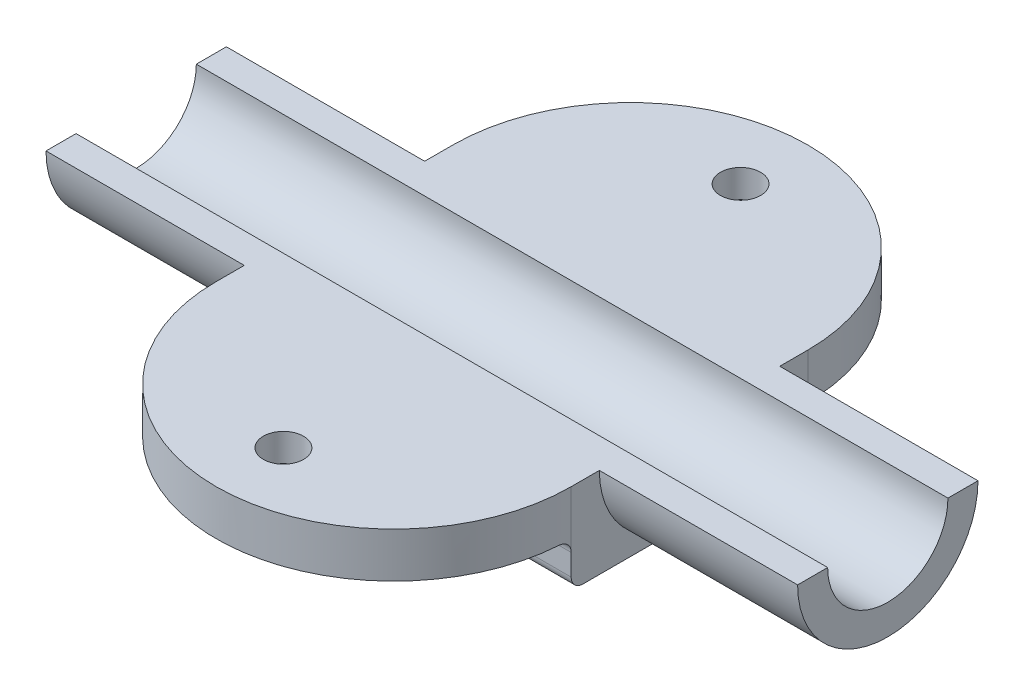
ISO-10303-21;
HEADER;
FILE_DESCRIPTION(('STEP AP214'),'2;1');
FILE_NAME('part.step','',(''),(''),'','','');
FILE_SCHEMA(('AUTOMOTIVE_DESIGN { 1 0 10303 214 1 1 1 1 }'));
ENDSEC;
DATA;
#1=APPLICATION_CONTEXT('core data for automotive mechanical design processes');
#2=APPLICATION_PROTOCOL_DEFINITION('international standard','automotive_design',2000,#1);
#3=PRODUCT_CONTEXT('',#1,'mechanical');
#4=PRODUCT('Part','Part','',(#3));
#5=PRODUCT_RELATED_PRODUCT_CATEGORY('part','',(#4));
#6=PRODUCT_DEFINITION_FORMATION('','',#4);
#7=PRODUCT_DEFINITION_CONTEXT('part definition',#1,'design');
#8=PRODUCT_DEFINITION('design','',#6,#7);
#9=PRODUCT_DEFINITION_SHAPE('','',#8);
#10=(LENGTH_UNIT() NAMED_UNIT(*) SI_UNIT(.MILLI.,.METRE.));
#11=(NAMED_UNIT(*) PLANE_ANGLE_UNIT() SI_UNIT($,.RADIAN.));
#12=(NAMED_UNIT(*) SI_UNIT($,.STERADIAN.) SOLID_ANGLE_UNIT());
#13=UNCERTAINTY_MEASURE_WITH_UNIT(LENGTH_MEASURE(1.E-05),#10,'distance_accuracy_value','');
#14=(GEOMETRIC_REPRESENTATION_CONTEXT(3) GLOBAL_UNCERTAINTY_ASSIGNED_CONTEXT((#13)) GLOBAL_UNIT_ASSIGNED_CONTEXT((#10,
#11,#12)) REPRESENTATION_CONTEXT('',''));
#15=CARTESIAN_POINT('',(0.,0.,0.));
#16=DIRECTION('',(0.,0.,1.));
#17=DIRECTION('',(1.,0.,0.));
#18=AXIS2_PLACEMENT_3D('',#15,#16,#17);
#19=CARTESIAN_POINT('',(0.,-2.38,10.));
#20=DIRECTION('',(0.,1.,0.));
#21=DIRECTION('',(0.,0.,1.));
#22=AXIS2_PLACEMENT_3D('',#19,#20,#21);
#23=CYLINDRICAL_SURFACE('',#22,15.);
#24=CARTESIAN_POINT('',(0.,3.81,10.));
#25=DIRECTION('',(0.,1.,0.));
#26=DIRECTION('',(0.,0.,1.));
#27=AXIS2_PLACEMENT_3D('',#24,#25,#26);
#28=CIRCLE('',#27,15.);
#29=CARTESIAN_POINT('',(14.9666295470958,3.81,11.));
#30=VERTEX_POINT('',#29);
#31=CARTESIAN_POINT('',(-14.9666295470958,3.81,11.));
#32=VERTEX_POINT('',#31);
#33=EDGE_CURVE('E305',#30,#32,#28,.F.);
#34=ORIENTED_EDGE('',*,*,#33,.F.);
#35=CARTESIAN_POINT('',(14.9666295470958,3.81,11.));
#36=CARTESIAN_POINT('',(14.9685052352705,3.80999981580497,10.9719338624868));
#37=CARTESIAN_POINT('',(14.9703001133049,3.80881768125993,10.9438756382153));
#38=CARTESIAN_POINT('',(14.9737213296838,3.80409899865972,10.887948540566));
#39=CARTESIAN_POINT('',(14.9753476736626,3.80056252934486,10.860079660887));
#40=CARTESIAN_POINT('',(14.9799587205708,3.78645098887139,10.7771042059867));
#41=CARTESIAN_POINT('',(14.9826815597924,3.77237371105249,10.722536755714));
#42=CARTESIAN_POINT('',(14.9874196124845,3.73525327582691,10.6165060866997));
#43=CARTESIAN_POINT('',(14.989434435225,3.71220518247573,10.565044594963));
#44=CARTESIAN_POINT('',(14.9928185152767,3.65779250585983,10.4667053899498));
#45=CARTESIAN_POINT('',(14.9941879007984,3.62642957620271,10.4198267677926));
#46=CARTESIAN_POINT('',(14.9963887838828,3.55631614422093,10.3320443063483));
#47=CARTESIAN_POINT('',(14.9972209105848,3.5175743518014,10.291133522255));
#48=CARTESIAN_POINT('',(14.9984860318399,3.43376691145595,10.2163751241324));
#49=CARTESIAN_POINT('',(14.9989189448031,3.38869997298645,10.1825289550374));
#50=CARTESIAN_POINT('',(14.9995267197743,3.29349931787441,10.1228523061549));
#51=CARTESIAN_POINT('',(14.9997014008145,3.24336207424709,10.0970274576778));
#52=CARTESIAN_POINT('',(14.9999175978719,3.13947522912901,10.0541677248818));
#53=CARTESIAN_POINT('',(14.9999591905044,3.08572772416698,10.0371277880778));
#54=CARTESIAN_POINT('',(14.9999931652375,2.99471647626314,10.0165041522442));
#55=CARTESIAN_POINT('',(14.999997428215,2.95802101139367,10.010319008137));
#56=CARTESIAN_POINT('',(15.0000000165618,2.88422212892106,10.0020673513042));
#57=CARTESIAN_POINT('',(14.999998350248,2.84711935545359,9.99999507595593));
#58=CARTESIAN_POINT('',(15.,2.81,10.));
#59=B_SPLINE_CURVE_WITH_KNOTS('',3,(#35,#36,#37,#38,#39,#40,#41,#42,#43,#44,#45,#46,#47,#48,#49,
#50,#51,#52,#53,#54,#55,#56,#57,#58),.UNSPECIFIED.,.F.,.F.,(4,2,2,2,2,2,2,2,2,2,2,4),(0.,
0.0843347871955427,0.168666753970858,0.337057417592072,0.50554086482107,0.673990830117554,
0.842243178110092,1.01052990530963,1.17893451134199,1.34724215411878,1.45866639545222,
1.56993440752791),.UNSPECIFIED.);
#60=CARTESIAN_POINT('',(15.,2.81,10.));
#61=VERTEX_POINT('',#60);
#62=EDGE_CURVE('E230',#30,#61,#59,.T.);
#63=ORIENTED_EDGE('',*,*,#62,.T.);
#64=DIRECTION('',(0.,1.,0.));
#65=VECTOR('',#64,1.);
#66=CARTESIAN_POINT('',(15.,-2.38,10.));
#67=LINE('',#66,#65);
#68=CARTESIAN_POINT('',(15.,7.62,10.));
#69=VERTEX_POINT('',#68);
#70=EDGE_CURVE('E142',#61,#69,#67,.T.);
#71=ORIENTED_EDGE('',*,*,#70,.T.);
#72=CARTESIAN_POINT('',(0.,7.62,10.));
#73=DIRECTION('',(0.,1.,0.));
#74=DIRECTION('',(0.,0.,1.));
#75=AXIS2_PLACEMENT_3D('',#72,#73,#74);
#76=CIRCLE('',#75,15.);
#77=CARTESIAN_POINT('',(-15.,7.62,10.));
#78=VERTEX_POINT('',#77);
#79=EDGE_CURVE('E315',#69,#78,#76,.F.);
#80=ORIENTED_EDGE('',*,*,#79,.T.);
#81=DIRECTION('',(0.,1.,0.));
#82=VECTOR('',#81,1.);
#83=CARTESIAN_POINT('',(-15.,-2.38,10.));
#84=LINE('',#83,#82);
#85=CARTESIAN_POINT('',(-15.,2.81,10.));
#86=VERTEX_POINT('',#85);
#87=EDGE_CURVE('E384',#86,#78,#84,.T.);
#88=ORIENTED_EDGE('',*,*,#87,.F.);
#89=CARTESIAN_POINT('',(-15.,2.81,10.));
#90=CARTESIAN_POINT('',(-14.9999995440319,2.83813351518247,10.0000001872797));
#91=CARTESIAN_POINT('',(-15.0000000512423,2.86625355257342,10.0011879868366));
#92=CARTESIAN_POINT('',(-14.9999991051587,2.92229242739804,10.0059266043761));
#93=CARTESIAN_POINT('',(-14.9999976519585,2.95021127438074,10.0094773094524));
#94=CARTESIAN_POINT('',(-14.9999845367273,3.03331768555555,10.0236401308527));
#95=CARTESIAN_POINT('',(-14.9999641430549,3.08794861070489,10.0377630463945));
#96=CARTESIAN_POINT('',(-14.9998240084822,3.19406266233333,10.0749793984856));
#97=CARTESIAN_POINT('',(-14.9997042196172,3.24554425617129,10.0980771631293));
#98=CARTESIAN_POINT('',(-14.9992485725597,3.34389709460069,10.1525848283094));
#99=CARTESIAN_POINT('',(-14.9989127522644,3.39076914615338,10.1839932703861));
#100=CARTESIAN_POINT('',(-14.997886522338,3.47856299603249,10.2542227502167));
#101=CARTESIAN_POINT('',(-14.9971961821105,3.519485956989,10.293042336172));
#102=CARTESIAN_POINT('',(-14.995320246326,3.59423948694484,10.3770011615369));
#103=CARTESIAN_POINT('',(-14.994134563188,3.62806880013679,10.4221415175742));
#104=CARTESIAN_POINT('',(-14.9911491736432,3.6876468204234,10.5174111552522));
#105=CARTESIAN_POINT('',(-14.9893498300892,3.71340028547474,10.5675374763495));
#106=CARTESIAN_POINT('',(-14.9850579926239,3.75612082025845,10.6713635263531));
#107=CARTESIAN_POINT('',(-14.9825658844828,3.773092765026,10.7250612538769));
#108=CARTESIAN_POINT('',(-14.9778375337117,3.79360793033813,10.8159022100046));
#109=CARTESIAN_POINT('',(-14.975800702035,3.7997527249433,10.8524898255573));
#110=CARTESIAN_POINT('',(-14.9714328347826,3.80794829179419,10.9260498717791));
#111=CARTESIAN_POINT('',(-14.969102226659,3.81000494091644,10.9630216731405));
#112=CARTESIAN_POINT('',(-14.9666295470958,3.81,11.));
#113=B_SPLINE_CURVE_WITH_KNOTS('',3,(#89,#90,#91,#92,#93,#94,#95,#96,#97,#98,#99,#100,#101,#102,
#103,#104,#105,#106,#107,#108,#109,#110,#111,#112),.UNSPECIFIED.,.F.,.F.,(4,2,2,2,2,2,2,2,2,2,2,
4),(0.,0.0843487072800825,0.168693384429747,0.337105836070256,0.505599605119889,
0.674063824404927,0.842495076359686,1.01095612102085,1.17931772809563,1.34758576916591,
1.45883984661059,1.56993387576663),.UNSPECIFIED.);
#114=EDGE_CURVE('E225',#86,#32,#113,.T.);
#115=ORIENTED_EDGE('',*,*,#114,.T.);
#116=EDGE_LOOP('',(#34,#63,#71,#80,#88,#115));
#117=FACE_BOUND('',#116,.T.);
#118=ADVANCED_FACE('F111',(#117),#23,.T.);
#119=CARTESIAN_POINT('',(0.,-2.38,-10.));
#120=DIRECTION('',(0.,1.,0.));
#121=DIRECTION('',(0.,0.,1.));
#122=AXIS2_PLACEMENT_3D('',#119,#120,#121);
#123=CYLINDRICAL_SURFACE('',#122,15.);
#124=CARTESIAN_POINT('',(0.,3.81,-10.));
#125=DIRECTION('',(0.,-1.,0.));
#126=DIRECTION('',(0.,0.,-1.));
#127=AXIS2_PLACEMENT_3D('',#124,#125,#126);
#128=CIRCLE('',#127,15.);
#129=CARTESIAN_POINT('',(-14.9666295470958,3.81,-11.));
#130=VERTEX_POINT('',#129);
#131=CARTESIAN_POINT('',(14.9666295470958,3.81,-11.));
#132=VERTEX_POINT('',#131);
#133=EDGE_CURVE('E363',#130,#132,#128,.T.);
#134=ORIENTED_EDGE('',*,*,#133,.F.);
#135=CARTESIAN_POINT('',(-14.9666295470958,3.81,-11.));
#136=CARTESIAN_POINT('',(-14.9685052352705,3.80999981580497,-10.9719338624868));
#137=CARTESIAN_POINT('',(-14.9703001133049,3.80881768125993,-10.9438756382153));
#138=CARTESIAN_POINT('',(-14.9737213296838,3.80409899865972,-10.887948540566));
#139=CARTESIAN_POINT('',(-14.9753476736626,3.80056252934486,-10.860079660887));
#140=CARTESIAN_POINT('',(-14.9799587205708,3.78645098887139,-10.7771042059867));
#141=CARTESIAN_POINT('',(-14.9826815597924,3.77237371105249,-10.722536755714));
#142=CARTESIAN_POINT('',(-14.9874196124845,3.73525327582691,-10.6165060866997));
#143=CARTESIAN_POINT('',(-14.989434435225,3.71220518247573,-10.565044594963));
#144=CARTESIAN_POINT('',(-14.9928185152767,3.65779250585983,-10.4667053899498));
#145=CARTESIAN_POINT('',(-14.9941879007984,3.62642957620271,-10.4198267677926));
#146=CARTESIAN_POINT('',(-14.9963887838828,3.55631614422093,-10.3320443063483));
#147=CARTESIAN_POINT('',(-14.9972209105848,3.5175743518014,-10.291133522255));
#148=CARTESIAN_POINT('',(-14.9984860318399,3.43376691145595,-10.2163751241324));
#149=CARTESIAN_POINT('',(-14.9989189448031,3.38869997298645,-10.1825289550374));
#150=CARTESIAN_POINT('',(-14.9995267197743,3.29349931787441,-10.1228523061549));
#151=CARTESIAN_POINT('',(-14.9997014008145,3.24336207424709,-10.0970274576778));
#152=CARTESIAN_POINT('',(-14.9999175978719,3.13947522912901,-10.0541677248818));
#153=CARTESIAN_POINT('',(-14.9999591905044,3.08572772416698,-10.0371277880778));
#154=CARTESIAN_POINT('',(-14.9999931652375,2.99471647626314,-10.0165041522442));
#155=CARTESIAN_POINT('',(-14.999997428215,2.95802101139367,-10.010319008137));
#156=CARTESIAN_POINT('',(-15.0000000165618,2.88422212892106,-10.0020673513042));
#157=CARTESIAN_POINT('',(-14.999998350248,2.84711935545359,-9.99999507595593));
#158=CARTESIAN_POINT('',(-15.,2.81,-10.));
#159=B_SPLINE_CURVE_WITH_KNOTS('',3,(#135,#136,#137,#138,#139,#140,#141,#142,#143,#144,#145,
#146,#147,#148,#149,#150,#151,#152,#153,#154,#155,#156,#157,#158),.UNSPECIFIED.,.F.,.F.,(4,2,2,
2,2,2,2,2,2,2,2,4),(0.,0.0843347871955427,0.168666753970858,0.337057417592072,0.50554086482107,
0.673990830117554,0.842243178110092,1.01052990530963,1.17893451134199,1.34724215411878,
1.45866639545222,1.56993440752791),.UNSPECIFIED.);
#160=CARTESIAN_POINT('',(-15.,2.81,-10.));
#161=VERTEX_POINT('',#160);
#162=EDGE_CURVE('E12',#130,#161,#159,.T.);
#163=ORIENTED_EDGE('',*,*,#162,.T.);
#164=DIRECTION('',(0.,1.,0.));
#165=VECTOR('',#164,1.);
#166=CARTESIAN_POINT('',(-15.,-2.38,-10.));
#167=LINE('',#166,#165);
#168=CARTESIAN_POINT('',(-15.,7.62,-10.));
#169=VERTEX_POINT('',#168);
#170=EDGE_CURVE('E133',#161,#169,#167,.T.);
#171=ORIENTED_EDGE('',*,*,#170,.T.);
#172=CARTESIAN_POINT('',(0.,7.62,-10.));
#173=DIRECTION('',(0.,1.,0.));
#174=DIRECTION('',(0.,0.,1.));
#175=AXIS2_PLACEMENT_3D('',#172,#173,#174);
#176=CIRCLE('',#175,15.);
#177=CARTESIAN_POINT('',(15.,7.62,-10.));
#178=VERTEX_POINT('',#177);
#179=EDGE_CURVE('E368',#178,#169,#176,.T.);
#180=ORIENTED_EDGE('',*,*,#179,.F.);
#181=DIRECTION('',(0.,1.,0.));
#182=VECTOR('',#181,1.);
#183=CARTESIAN_POINT('',(15.,-2.38,-10.));
#184=LINE('',#183,#182);
#185=CARTESIAN_POINT('',(15.,2.81,-10.));
#186=VERTEX_POINT('',#185);
#187=EDGE_CURVE('E157',#186,#178,#184,.T.);
#188=ORIENTED_EDGE('',*,*,#187,.F.);
#189=CARTESIAN_POINT('',(15.,2.81,-10.));
#190=CARTESIAN_POINT('',(14.9999995440319,2.83813351518247,-10.0000001872797));
#191=CARTESIAN_POINT('',(15.0000000512423,2.86625355257342,-10.0011879868366));
#192=CARTESIAN_POINT('',(14.9999991051587,2.92229242739804,-10.0059266043761));
#193=CARTESIAN_POINT('',(14.9999976519585,2.95021127438074,-10.0094773094524));
#194=CARTESIAN_POINT('',(14.9999845367273,3.03331768555555,-10.0236401308527));
#195=CARTESIAN_POINT('',(14.9999641430549,3.08794861070489,-10.0377630463945));
#196=CARTESIAN_POINT('',(14.9998240084822,3.19406266233333,-10.0749793984856));
#197=CARTESIAN_POINT('',(14.9997042196172,3.24554425617129,-10.0980771631293));
#198=CARTESIAN_POINT('',(14.9992485725597,3.34389709460069,-10.1525848283094));
#199=CARTESIAN_POINT('',(14.9989127522644,3.39076914615338,-10.1839932703861));
#200=CARTESIAN_POINT('',(14.997886522338,3.47856299603249,-10.2542227502167));
#201=CARTESIAN_POINT('',(14.9971961821105,3.519485956989,-10.293042336172));
#202=CARTESIAN_POINT('',(14.995320246326,3.59423948694484,-10.3770011615369));
#203=CARTESIAN_POINT('',(14.994134563188,3.62806880013679,-10.4221415175742));
#204=CARTESIAN_POINT('',(14.9911491736432,3.6876468204234,-10.5174111552522));
#205=CARTESIAN_POINT('',(14.9893498300892,3.71340028547474,-10.5675374763495));
#206=CARTESIAN_POINT('',(14.9850579926239,3.75612082025845,-10.6713635263531));
#207=CARTESIAN_POINT('',(14.9825658844828,3.773092765026,-10.7250612538769));
#208=CARTESIAN_POINT('',(14.9778375337117,3.79360793033813,-10.8159022100046));
#209=CARTESIAN_POINT('',(14.975800702035,3.7997527249433,-10.8524898255573));
#210=CARTESIAN_POINT('',(14.9714328347826,3.80794829179419,-10.9260498717791));
#211=CARTESIAN_POINT('',(14.969102226659,3.81000494091644,-10.9630216731405));
#212=CARTESIAN_POINT('',(14.9666295470958,3.81,-11.));
#213=B_SPLINE_CURVE_WITH_KNOTS('',3,(#189,#190,#191,#192,#193,#194,#195,#196,#197,#198,#199,
#200,#201,#202,#203,#204,#205,#206,#207,#208,#209,#210,#211,#212),.UNSPECIFIED.,.F.,.F.,(4,2,2,
2,2,2,2,2,2,2,2,4),(0.,0.0843487072800826,0.168693384429747,0.337105836070256,0.505599605119887,
0.674063824404927,0.842495076359686,1.01095612102085,1.17931772809563,1.34758576916591,
1.45883984661059,1.56993387576663),.UNSPECIFIED.);
#214=EDGE_CURVE('E126',#186,#132,#213,.T.);
#215=ORIENTED_EDGE('',*,*,#214,.T.);
#216=EDGE_LOOP('',(#134,#163,#171,#180,#188,#215));
#217=FACE_BOUND('',#216,.T.);
#218=ADVANCED_FACE('F268',(#217),#123,.T.);
#219=CARTESIAN_POINT('',(0.,0.,0.));
#220=DIRECTION('',(0.,1.,0.));
#221=DIRECTION('',(0.,0.,1.));
#222=AXIS2_PLACEMENT_3D('',#219,#220,#221);
#223=PLANE('',#222);
#224=DIRECTION('',(0.,0.,1.));
#225=VECTOR('',#224,1.);
#226=CARTESIAN_POINT('',(-15.,0.,-15.));
#227=LINE('',#226,#225);
#228=CARTESIAN_POINT('',(-15.,0.,-9.));
#229=VERTEX_POINT('',#228);
#230=CARTESIAN_POINT('',(-15.,0.,0.));
#231=VERTEX_POINT('',#230);
#232=EDGE_CURVE('E219',#229,#231,#227,.T.);
#233=ORIENTED_EDGE('',*,*,#232,.F.);
#234=DIRECTION('',(-1.,0.,0.));
#235=VECTOR('',#234,1.);
#236=CARTESIAN_POINT('',(0.,0.,-9.));
#237=LINE('',#236,#235);
#238=CARTESIAN_POINT('',(15.,0.,-9.));
#239=VERTEX_POINT('',#238);
#240=EDGE_CURVE('E204',#229,#239,#237,.F.);
#241=ORIENTED_EDGE('',*,*,#240,.T.);
#242=DIRECTION('',(0.,0.,-1.));
#243=VECTOR('',#242,1.);
#244=CARTESIAN_POINT('',(15.,0.,-15.));
#245=LINE('',#244,#243);
#246=CARTESIAN_POINT('',(15.,0.,0.));
#247=VERTEX_POINT('',#246);
#248=EDGE_CURVE('E349',#247,#239,#245,.T.);
#249=ORIENTED_EDGE('',*,*,#248,.F.);
#250=CARTESIAN_POINT('',(15.,0.,9.));
#251=VERTEX_POINT('',#250);
#252=EDGE_CURVE('E199',#251,#247,#245,.T.);
#253=ORIENTED_EDGE('',*,*,#252,.F.);
#254=DIRECTION('',(1.,0.,0.));
#255=VECTOR('',#254,1.);
#256=CARTESIAN_POINT('',(0.,0.,9.));
#257=LINE('',#256,#255);
#258=CARTESIAN_POINT('',(-15.,0.,9.));
#259=VERTEX_POINT('',#258);
#260=EDGE_CURVE('E191',#251,#259,#257,.F.);
#261=ORIENTED_EDGE('',*,*,#260,.T.);
#262=EDGE_CURVE('E196',#231,#259,#227,.T.);
#263=ORIENTED_EDGE('',*,*,#262,.F.);
#264=EDGE_LOOP('',(#233,#241,#249,#253,#261,#263));
#265=FACE_BOUND('',#264,.T.);
#266=ADVANCED_FACE('F194',(#265),#223,.F.);
#267=CARTESIAN_POINT('',(0.,7.62,0.));
#268=DIRECTION('',(0.,1.,0.));
#269=DIRECTION('',(0.,0.,1.));
#270=AXIS2_PLACEMENT_3D('',#267,#268,#269);
#271=PLANE('',#270);
#272=CARTESIAN_POINT('',(0.,7.62,-19.31));
#273=DIRECTION('',(0.,-1.,0.));
#274=DIRECTION('',(0.,0.,-1.));
#275=AXIS2_PLACEMENT_3D('',#272,#273,#274);
#276=CIRCLE('',#275,1.7);
#277=CARTESIAN_POINT('',(0.,7.62,-21.01));
#278=VERTEX_POINT('',#277);
#279=EDGE_CURVE('E379',#278,#278,#276,.T.);
#280=ORIENTED_EDGE('',*,*,#279,.T.);
#281=EDGE_LOOP('',(#280));
#282=FACE_BOUND('',#281,.T.);
#283=DIRECTION('',(0.,0.,-1.));
#284=VECTOR('',#283,1.);
#285=CARTESIAN_POINT('',(15.,7.62,-15.));
#286=LINE('',#285,#284);
#287=CARTESIAN_POINT('',(15.,7.62,-7.62));
#288=VERTEX_POINT('',#287);
#289=EDGE_CURVE('E465',#288,#178,#286,.T.);
#290=ORIENTED_EDGE('',*,*,#289,.T.);
#291=ORIENTED_EDGE('',*,*,#179,.T.);
#292=DIRECTION('',(0.,0.,1.));
#293=VECTOR('',#292,1.);
#294=CARTESIAN_POINT('',(-15.,7.62,-15.));
#295=LINE('',#294,#293);
#296=CARTESIAN_POINT('',(-15.,7.62,-7.62));
#297=VERTEX_POINT('',#296);
#298=EDGE_CURVE('E468',#169,#297,#295,.T.);
#299=ORIENTED_EDGE('',*,*,#298,.T.);
#300=DIRECTION('',(1.,0.,0.));
#301=VECTOR('',#300,1.);
#302=CARTESIAN_POINT('',(-31.75,7.62,-7.62000000000001));
#303=LINE('',#302,#301);
#304=CARTESIAN_POINT('',(-31.75,7.62,-7.62000000000001));
#305=VERTEX_POINT('',#304);
#306=EDGE_CURVE('E421',#305,#297,#303,.T.);
#307=ORIENTED_EDGE('',*,*,#306,.F.);
#308=DIRECTION('',(0.,0.,1.));
#309=VECTOR('',#308,1.);
#310=CARTESIAN_POINT('',(-31.75,7.62,-7.62000000000001));
#311=LINE('',#310,#309);
#312=CARTESIAN_POINT('',(-31.75,7.62,-5.08000000000001));
#313=VERTEX_POINT('',#312);
#314=EDGE_CURVE('E398',#305,#313,#311,.T.);
#315=ORIENTED_EDGE('',*,*,#314,.T.);
#316=DIRECTION('',(-1.,0.,0.));
#317=VECTOR('',#316,1.);
#318=CARTESIAN_POINT('',(31.75,7.62,-5.08000000000001));
#319=LINE('',#318,#317);
#320=CARTESIAN_POINT('',(31.75,7.62,-5.08000000000001));
#321=VERTEX_POINT('',#320);
#322=EDGE_CURVE('E357',#321,#313,#319,.T.);
#323=ORIENTED_EDGE('',*,*,#322,.F.);
#324=DIRECTION('',(0.,0.,1.));
#325=VECTOR('',#324,1.);
#326=CARTESIAN_POINT('',(31.75,7.62,-7.62000000000001));
#327=LINE('',#326,#325);
#328=CARTESIAN_POINT('',(31.75,7.62,-7.62000000000001));
#329=VERTEX_POINT('',#328);
#330=EDGE_CURVE('E426',#329,#321,#327,.T.);
#331=ORIENTED_EDGE('',*,*,#330,.F.);
#332=DIRECTION('',(-1.,0.,0.));
#333=VECTOR('',#332,1.);
#334=CARTESIAN_POINT('',(31.75,7.62,-7.62000000000001));
#335=LINE('',#334,#333);
#336=EDGE_CURVE('E442',#329,#288,#335,.T.);
#337=ORIENTED_EDGE('',*,*,#336,.T.);
#338=EDGE_LOOP('',(#290,#291,#299,#307,#315,#323,#331,#337));
#339=FACE_BOUND('',#338,.T.);
#340=ADVANCED_FACE('F287',(#282,#339),#271,.T.);
#341=CARTESIAN_POINT('',(-15.,3.81,-25.));
#342=DIRECTION('',(0.,-1.,0.));
#343=DIRECTION('',(0.,0.,-1.));
#344=AXIS2_PLACEMENT_3D('',#341,#342,#343);
#345=PLANE('',#344);
#346=CARTESIAN_POINT('',(0.,3.81,-19.31));
#347=DIRECTION('',(0.,-1.,0.));
#348=DIRECTION('',(0.,0.,-1.));
#349=AXIS2_PLACEMENT_3D('',#346,#347,#348);
#350=CIRCLE('',#349,3.15);
#351=CARTESIAN_POINT('',(0.,3.81,-22.46));
#352=VERTEX_POINT('',#351);
#353=EDGE_CURVE('E371',#352,#352,#350,.T.);
#354=ORIENTED_EDGE('',*,*,#353,.F.);
#355=EDGE_LOOP('',(#354));
#356=FACE_BOUND('',#355,.T.);
#357=ORIENTED_EDGE('',*,*,#133,.T.);
#358=DIRECTION('',(1.,0.,0.));
#359=VECTOR('',#358,1.);
#360=CARTESIAN_POINT('',(-15.,3.81,-11.));
#361=LINE('',#360,#359);
#362=EDGE_CURVE('E340',#132,#130,#361,.F.);
#363=ORIENTED_EDGE('',*,*,#362,.T.);
#364=EDGE_LOOP('',(#357,#363));
#365=FACE_BOUND('',#364,.T.);
#366=ADVANCED_FACE('F284',(#356,#365),#345,.T.);
#367=CARTESIAN_POINT('',(-15.,7.62,-15.));
#368=DIRECTION('',(1.,0.,0.));
#369=DIRECTION('',(0.,0.,-1.));
#370=AXIS2_PLACEMENT_3D('',#367,#368,#369);
#371=PLANE('',#370);
#372=CARTESIAN_POINT('',(-15.,1.,-10.));
#373=VERTEX_POINT('',#372);
#374=EDGE_CURVE('E361',#373,#161,#167,.T.);
#375=ORIENTED_EDGE('',*,*,#374,.F.);
#376=CARTESIAN_POINT('',(-15.,1.,-9.));
#377=DIRECTION('',(1.,0.,0.));
#378=DIRECTION('',(0.,0.,-1.));
#379=AXIS2_PLACEMENT_3D('',#376,#377,#378);
#380=CIRCLE('',#379,1.);
#381=EDGE_CURVE('E205',#373,#229,#380,.F.);
#382=ORIENTED_EDGE('',*,*,#381,.T.);
#383=ORIENTED_EDGE('',*,*,#232,.T.);
#384=CARTESIAN_POINT('',(-15.,7.62,0.));
#385=DIRECTION('',(1.,0.,0.));
#386=DIRECTION('',(0.,0.,-1.));
#387=AXIS2_PLACEMENT_3D('',#384,#385,#386);
#388=CIRCLE('',#387,7.62);
#389=EDGE_CURVE('E417',#231,#297,#388,.T.);
#390=ORIENTED_EDGE('',*,*,#389,.T.);
#391=ORIENTED_EDGE('',*,*,#298,.F.);
#392=ORIENTED_EDGE('',*,*,#170,.F.);
#393=EDGE_LOOP('',(#375,#382,#383,#390,#391,#392));
#394=FACE_BOUND('',#393,.T.);
#395=ADVANCED_FACE('F286',(#394),#371,.F.);
#396=CARTESIAN_POINT('',(0.,7.62,19.31));
#397=DIRECTION('',(0.,-1.,0.));
#398=DIRECTION('',(0.,0.,-1.));
#399=AXIS2_PLACEMENT_3D('',#396,#397,#398);
#400=CIRCLE('',#399,1.7);
#401=CARTESIAN_POINT('',(0.,7.62,17.61));
#402=VERTEX_POINT('',#401);
#403=EDGE_CURVE('E394',#402,#402,#400,.T.);
#404=ORIENTED_EDGE('',*,*,#403,.T.);
#405=EDGE_LOOP('',(#404));
#406=FACE_BOUND('',#405,.T.);
#407=ORIENTED_EDGE('',*,*,#79,.F.);
#408=CARTESIAN_POINT('',(15.,7.62,7.62));
#409=VERTEX_POINT('',#408);
#410=EDGE_CURVE('E460',#69,#409,#286,.T.);
#411=ORIENTED_EDGE('',*,*,#410,.T.);
#412=DIRECTION('',(-1.,0.,0.));
#413=VECTOR('',#412,1.);
#414=CARTESIAN_POINT('',(31.75,7.62,7.61999999999999));
#415=LINE('',#414,#413);
#416=CARTESIAN_POINT('',(31.75,7.62,7.61999999999999));
#417=VERTEX_POINT('',#416);
#418=EDGE_CURVE('E449',#417,#409,#415,.T.);
#419=ORIENTED_EDGE('',*,*,#418,.F.);
#420=DIRECTION('',(0.,0.,-1.));
#421=VECTOR('',#420,1.);
#422=CARTESIAN_POINT('',(31.75,7.62,7.61999999999999));
#423=LINE('',#422,#421);
#424=CARTESIAN_POINT('',(31.75,7.62,5.07999999999999));
#425=VERTEX_POINT('',#424);
#426=EDGE_CURVE('E434',#417,#425,#423,.T.);
#427=ORIENTED_EDGE('',*,*,#426,.T.);
#428=DIRECTION('',(-1.,0.,0.));
#429=VECTOR('',#428,1.);
#430=CARTESIAN_POINT('',(31.75,7.62,5.07999999999999));
#431=LINE('',#430,#429);
#432=CARTESIAN_POINT('',(-31.75,7.62,5.07999999999999));
#433=VERTEX_POINT('',#432);
#434=EDGE_CURVE('E453',#425,#433,#431,.T.);
#435=ORIENTED_EDGE('',*,*,#434,.T.);
#436=DIRECTION('',(0.,0.,-1.));
#437=VECTOR('',#436,1.);
#438=CARTESIAN_POINT('',(-31.75,7.62,7.61999999999999));
#439=LINE('',#438,#437);
#440=CARTESIAN_POINT('',(-31.75,7.62,7.61999999999999));
#441=VERTEX_POINT('',#440);
#442=EDGE_CURVE('E406',#441,#433,#439,.T.);
#443=ORIENTED_EDGE('',*,*,#442,.F.);
#444=DIRECTION('',(1.,0.,0.));
#445=VECTOR('',#444,1.);
#446=CARTESIAN_POINT('',(-31.75,7.62,7.61999999999999));
#447=LINE('',#446,#445);
#448=CARTESIAN_POINT('',(-15.,7.62,7.62));
#449=VERTEX_POINT('',#448);
#450=EDGE_CURVE('E414',#441,#449,#447,.T.);
#451=ORIENTED_EDGE('',*,*,#450,.T.);
#452=EDGE_CURVE('E464',#449,#78,#295,.T.);
#453=ORIENTED_EDGE('',*,*,#452,.T.);
#454=EDGE_LOOP('',(#407,#411,#419,#427,#435,#443,#451,#453));
#455=FACE_BOUND('',#454,.T.);
#456=ADVANCED_FACE('F293',(#406,#455),#271,.T.);
#457=CARTESIAN_POINT('',(-15.,3.81,25.));
#458=DIRECTION('',(0.,1.,0.));
#459=DIRECTION('',(0.,0.,1.));
#460=AXIS2_PLACEMENT_3D('',#457,#458,#459);
#461=PLANE('',#460);
#462=CARTESIAN_POINT('',(0.,3.81,19.31));
#463=DIRECTION('',(0.,-1.,0.));
#464=DIRECTION('',(0.,0.,-1.));
#465=AXIS2_PLACEMENT_3D('',#462,#463,#464);
#466=CIRCLE('',#465,3.15);
#467=CARTESIAN_POINT('',(0.,3.81,16.16));
#468=VERTEX_POINT('',#467);
#469=EDGE_CURVE('E386',#468,#468,#466,.T.);
#470=ORIENTED_EDGE('',*,*,#469,.F.);
#471=EDGE_LOOP('',(#470));
#472=FACE_BOUND('',#471,.T.);
#473=ORIENTED_EDGE('',*,*,#33,.T.);
#474=DIRECTION('',(-1.,0.,0.));
#475=VECTOR('',#474,1.);
#476=CARTESIAN_POINT('',(15.,3.81,11.));
#477=LINE('',#476,#475);
#478=EDGE_CURVE('E318',#32,#30,#477,.F.);
#479=ORIENTED_EDGE('',*,*,#478,.T.);
#480=EDGE_LOOP('',(#473,#479));
#481=FACE_BOUND('',#480,.T.);
#482=ADVANCED_FACE('F631',(#472,#481),#461,.F.);
#483=ORIENTED_EDGE('',*,*,#262,.T.);
#484=CARTESIAN_POINT('',(-15.,1.,9.));
#485=DIRECTION('',(1.,0.,0.));
#486=DIRECTION('',(0.,0.,-1.));
#487=AXIS2_PLACEMENT_3D('',#484,#485,#486);
#488=CIRCLE('',#487,1.);
#489=CARTESIAN_POINT('',(-15.,1.,10.));
#490=VERTEX_POINT('',#489);
#491=EDGE_CURVE('E213',#259,#490,#488,.F.);
#492=ORIENTED_EDGE('',*,*,#491,.T.);
#493=EDGE_CURVE('E316',#490,#86,#84,.T.);
#494=ORIENTED_EDGE('',*,*,#493,.T.);
#495=ORIENTED_EDGE('',*,*,#87,.T.);
#496=ORIENTED_EDGE('',*,*,#452,.F.);
#497=EDGE_CURVE('E217',#449,#231,#388,.T.);
#498=ORIENTED_EDGE('',*,*,#497,.T.);
#499=EDGE_LOOP('',(#483,#492,#494,#495,#496,#498));
#500=FACE_BOUND('',#499,.T.);
#501=ADVANCED_FACE('F210',(#500),#371,.F.);
#502=CARTESIAN_POINT('',(15.,7.62,-15.));
#503=DIRECTION('',(-1.,0.,0.));
#504=DIRECTION('',(0.,0.,1.));
#505=AXIS2_PLACEMENT_3D('',#502,#503,#504);
#506=PLANE('',#505);
#507=CARTESIAN_POINT('',(15.,1.,10.));
#508=VERTEX_POINT('',#507);
#509=EDGE_CURVE('E472',#508,#61,#67,.T.);
#510=ORIENTED_EDGE('',*,*,#509,.F.);
#511=CARTESIAN_POINT('',(15.,1.,9.));
#512=DIRECTION('',(-1.,0.,0.));
#513=DIRECTION('',(0.,0.,1.));
#514=AXIS2_PLACEMENT_3D('',#511,#512,#513);
#515=CIRCLE('',#514,1.);
#516=EDGE_CURVE('E226',#508,#251,#515,.F.);
#517=ORIENTED_EDGE('',*,*,#516,.T.);
#518=ORIENTED_EDGE('',*,*,#252,.T.);
#519=CARTESIAN_POINT('',(15.,7.62,0.));
#520=DIRECTION('',(1.,0.,0.));
#521=DIRECTION('',(0.,0.,-1.));
#522=AXIS2_PLACEMENT_3D('',#519,#520,#521);
#523=CIRCLE('',#522,7.62);
#524=EDGE_CURVE('E425',#409,#247,#523,.T.);
#525=ORIENTED_EDGE('',*,*,#524,.F.);
#526=ORIENTED_EDGE('',*,*,#410,.F.);
#527=ORIENTED_EDGE('',*,*,#70,.F.);
#528=EDGE_LOOP('',(#510,#517,#518,#525,#526,#527));
#529=FACE_BOUND('',#528,.T.);
#530=ADVANCED_FACE('F512',(#529),#506,.F.);
#531=ORIENTED_EDGE('',*,*,#248,.T.);
#532=CARTESIAN_POINT('',(15.,1.,-9.));
#533=DIRECTION('',(-1.,0.,0.));
#534=DIRECTION('',(0.,0.,1.));
#535=AXIS2_PLACEMENT_3D('',#532,#533,#534);
#536=CIRCLE('',#535,1.);
#537=CARTESIAN_POINT('',(15.,1.,-10.));
#538=VERTEX_POINT('',#537);
#539=EDGE_CURVE('E169',#239,#538,#536,.F.);
#540=ORIENTED_EDGE('',*,*,#539,.T.);
#541=EDGE_CURVE('E329',#538,#186,#184,.T.);
#542=ORIENTED_EDGE('',*,*,#541,.T.);
#543=ORIENTED_EDGE('',*,*,#187,.T.);
#544=ORIENTED_EDGE('',*,*,#289,.F.);
#545=EDGE_CURVE('E355',#247,#288,#523,.T.);
#546=ORIENTED_EDGE('',*,*,#545,.F.);
#547=EDGE_LOOP('',(#531,#540,#542,#543,#544,#546));
#548=FACE_BOUND('',#547,.T.);
#549=ADVANCED_FACE('F255',(#548),#506,.F.);
#550=CARTESIAN_POINT('',(31.75,7.62,0.));
#551=DIRECTION('',(-1.,0.,0.));
#552=DIRECTION('',(0.,0.,1.));
#553=AXIS2_PLACEMENT_3D('',#550,#551,#552);
#554=CYLINDRICAL_SURFACE('',#553,5.08);
#555=ORIENTED_EDGE('',*,*,#322,.T.);
#556=CARTESIAN_POINT('',(-31.75,7.62,0.));
#557=DIRECTION('',(1.,0.,0.));
#558=DIRECTION('',(0.,0.,-1.));
#559=AXIS2_PLACEMENT_3D('',#556,#557,#558);
#560=CIRCLE('',#559,5.08);
#561=EDGE_CURVE('E410',#433,#313,#560,.T.);
#562=ORIENTED_EDGE('',*,*,#561,.F.);
#563=ORIENTED_EDGE('',*,*,#434,.F.);
#564=CARTESIAN_POINT('',(31.75,7.62,0.));
#565=DIRECTION('',(1.,0.,0.));
#566=DIRECTION('',(0.,0.,-1.));
#567=AXIS2_PLACEMENT_3D('',#564,#565,#566);
#568=CIRCLE('',#567,5.08);
#569=EDGE_CURVE('E430',#425,#321,#568,.T.);
#570=ORIENTED_EDGE('',*,*,#569,.T.);
#571=EDGE_LOOP('',(#555,#562,#563,#570));
#572=FACE_BOUND('',#571,.T.);
#573=ADVANCED_FACE('F547',(#572),#554,.F.);
#574=CARTESIAN_POINT('',(31.75,7.62,0.));
#575=DIRECTION('',(-1.,0.,0.));
#576=DIRECTION('',(0.,0.,1.));
#577=AXIS2_PLACEMENT_3D('',#574,#575,#576);
#578=CYLINDRICAL_SURFACE('',#577,7.62);
#579=ORIENTED_EDGE('',*,*,#524,.T.);
#580=ORIENTED_EDGE('',*,*,#545,.T.);
#581=ORIENTED_EDGE('',*,*,#336,.F.);
#582=CARTESIAN_POINT('',(31.75,7.62,0.));
#583=DIRECTION('',(1.,0.,0.));
#584=DIRECTION('',(0.,0.,-1.));
#585=AXIS2_PLACEMENT_3D('',#582,#583,#584);
#586=CIRCLE('',#585,7.62);
#587=EDGE_CURVE('E438',#417,#329,#586,.T.);
#588=ORIENTED_EDGE('',*,*,#587,.F.);
#589=ORIENTED_EDGE('',*,*,#418,.T.);
#590=EDGE_LOOP('',(#579,#580,#581,#588,#589));
#591=FACE_BOUND('',#590,.T.);
#592=ADVANCED_FACE('F514',(#591),#578,.T.);
#593=CARTESIAN_POINT('',(31.75,7.62,0.));
#594=DIRECTION('',(1.,0.,0.));
#595=DIRECTION('',(0.,0.,-1.));
#596=AXIS2_PLACEMENT_3D('',#593,#594,#595);
#597=PLANE('',#596);
#598=ORIENTED_EDGE('',*,*,#330,.T.);
#599=ORIENTED_EDGE('',*,*,#569,.F.);
#600=ORIENTED_EDGE('',*,*,#426,.F.);
#601=ORIENTED_EDGE('',*,*,#587,.T.);
#602=EDGE_LOOP('',(#598,#599,#600,#601));
#603=FACE_BOUND('',#602,.T.);
#604=ADVANCED_FACE('F544',(#603),#597,.T.);
#605=CARTESIAN_POINT('',(-31.75,7.62,0.));
#606=DIRECTION('',(1.,0.,0.));
#607=DIRECTION('',(0.,0.,-1.));
#608=AXIS2_PLACEMENT_3D('',#605,#606,#607);
#609=CYLINDRICAL_SURFACE('',#608,7.62);
#610=ORIENTED_EDGE('',*,*,#497,.F.);
#611=ORIENTED_EDGE('',*,*,#450,.F.);
#612=CARTESIAN_POINT('',(-31.75,7.62,0.));
#613=DIRECTION('',(1.,0.,0.));
#614=DIRECTION('',(0.,0.,-1.));
#615=AXIS2_PLACEMENT_3D('',#612,#613,#614);
#616=CIRCLE('',#615,7.62);
#617=EDGE_CURVE('E402',#441,#305,#616,.T.);
#618=ORIENTED_EDGE('',*,*,#617,.T.);
#619=ORIENTED_EDGE('',*,*,#306,.T.);
#620=ORIENTED_EDGE('',*,*,#389,.F.);
#621=EDGE_LOOP('',(#610,#611,#618,#619,#620));
#622=FACE_BOUND('',#621,.T.);
#623=ADVANCED_FACE('F556',(#622),#609,.T.);
#624=CARTESIAN_POINT('',(-31.75,7.62,0.));
#625=DIRECTION('',(-1.,0.,0.));
#626=DIRECTION('',(0.,0.,-1.));
#627=AXIS2_PLACEMENT_3D('',#624,#625,#626);
#628=PLANE('',#627);
#629=ORIENTED_EDGE('',*,*,#314,.F.);
#630=ORIENTED_EDGE('',*,*,#617,.F.);
#631=ORIENTED_EDGE('',*,*,#442,.T.);
#632=ORIENTED_EDGE('',*,*,#561,.T.);
#633=EDGE_LOOP('',(#629,#630,#631,#632));
#634=FACE_BOUND('',#633,.T.);
#635=ADVANCED_FACE('F553',(#634),#628,.T.);
#636=CARTESIAN_POINT('',(0.,3.81,19.31));
#637=DIRECTION('',(0.,-1.,0.));
#638=DIRECTION('',(0.,0.,-1.));
#639=AXIS2_PLACEMENT_3D('',#636,#637,#638);
#640=CYLINDRICAL_SURFACE('',#639,1.69999999999999);
#641=ORIENTED_EDGE('',*,*,#403,.F.);
#642=EDGE_LOOP('',(#641));
#643=FACE_BOUND('',#642,.T.);
#644=CARTESIAN_POINT('',(0.,5.26000000000001,19.31));
#645=DIRECTION('',(0.,-1.,0.));
#646=DIRECTION('',(0.,0.,-1.));
#647=AXIS2_PLACEMENT_3D('',#644,#645,#646);
#648=CIRCLE('',#647,1.69999999999999);
#649=CARTESIAN_POINT('',(0.,5.26000000000001,17.61));
#650=VERTEX_POINT('',#649);
#651=EDGE_CURVE('E390',#650,#650,#648,.T.);
#652=ORIENTED_EDGE('',*,*,#651,.T.);
#653=EDGE_LOOP('',(#652));
#654=FACE_BOUND('',#653,.T.);
#655=ADVANCED_FACE('F563',(#643,#654),#640,.F.);
#656=CARTESIAN_POINT('',(0.,3.81,19.31));
#657=DIRECTION('',(0.,-1.,0.));
#658=DIRECTION('',(0.,0.,-1.));
#659=AXIS2_PLACEMENT_3D('',#656,#657,#658);
#660=CONICAL_SURFACE('',#659,3.15,0.78539816339745);
#661=ORIENTED_EDGE('',*,*,#651,.F.);
#662=EDGE_LOOP('',(#661));
#663=FACE_BOUND('',#662,.T.);
#664=ORIENTED_EDGE('',*,*,#469,.T.);
#665=EDGE_LOOP('',(#664));
#666=FACE_BOUND('',#665,.T.);
#667=ADVANCED_FACE('F282',(#663,#666),#660,.F.);
#668=CARTESIAN_POINT('',(0.,3.81,-19.31));
#669=DIRECTION('',(0.,-1.,0.));
#670=DIRECTION('',(0.,0.,-1.));
#671=AXIS2_PLACEMENT_3D('',#668,#669,#670);
#672=CYLINDRICAL_SURFACE('',#671,1.69999999999999);
#673=ORIENTED_EDGE('',*,*,#279,.F.);
#674=EDGE_LOOP('',(#673));
#675=FACE_BOUND('',#674,.T.);
#676=CARTESIAN_POINT('',(0.,5.26000000000001,-19.31));
#677=DIRECTION('',(0.,-1.,0.));
#678=DIRECTION('',(0.,0.,-1.));
#679=AXIS2_PLACEMENT_3D('',#676,#677,#678);
#680=CIRCLE('',#679,1.69999999999999);
#681=CARTESIAN_POINT('',(0.,5.26000000000001,-21.01));
#682=VERTEX_POINT('',#681);
#683=EDGE_CURVE('E375',#682,#682,#680,.T.);
#684=ORIENTED_EDGE('',*,*,#683,.T.);
#685=EDGE_LOOP('',(#684));
#686=FACE_BOUND('',#685,.T.);
#687=ADVANCED_FACE('F279',(#675,#686),#672,.F.);
#688=CARTESIAN_POINT('',(0.,3.81,-19.31));
#689=DIRECTION('',(0.,-1.,0.));
#690=DIRECTION('',(0.,0.,-1.));
#691=AXIS2_PLACEMENT_3D('',#688,#689,#690);
#692=CONICAL_SURFACE('',#691,3.15,0.78539816339745);
#693=ORIENTED_EDGE('',*,*,#683,.F.);
#694=EDGE_LOOP('',(#693));
#695=FACE_BOUND('',#694,.T.);
#696=ORIENTED_EDGE('',*,*,#353,.T.);
#697=EDGE_LOOP('',(#696));
#698=FACE_BOUND('',#697,.T.);
#699=ADVANCED_FACE('F275',(#695,#698),#692,.F.);
#700=CARTESIAN_POINT('',(-15.,34.2238126514911,-10.));
#701=DIRECTION('',(0.,0.,1.));
#702=DIRECTION('',(1.,0.,0.));
#703=AXIS2_PLACEMENT_3D('',#700,#701,#702);
#704=PLANE('',#703);
#705=ORIENTED_EDGE('',*,*,#374,.T.);
#706=DIRECTION('',(1.,0.,0.));
#707=VECTOR('',#706,1.);
#708=CARTESIAN_POINT('',(-15.,2.81,-10.));
#709=LINE('',#708,#707);
#710=EDGE_CURVE('E336',#161,#186,#709,.T.);
#711=ORIENTED_EDGE('',*,*,#710,.T.);
#712=ORIENTED_EDGE('',*,*,#541,.F.);
#713=DIRECTION('',(-1.,0.,0.));
#714=VECTOR('',#713,1.);
#715=CARTESIAN_POINT('',(-15.,1.,-10.));
#716=LINE('',#715,#714);
#717=EDGE_CURVE('E327',#538,#373,#716,.T.);
#718=ORIENTED_EDGE('',*,*,#717,.T.);
#719=EDGE_LOOP('',(#705,#711,#712,#718));
#720=FACE_BOUND('',#719,.T.);
#721=ADVANCED_FACE('F273',(#720),#704,.F.);
#722=CARTESIAN_POINT('',(-15.,34.2238126514911,10.));
#723=DIRECTION('',(0.,0.,-1.));
#724=DIRECTION('',(-1.,0.,0.));
#725=AXIS2_PLACEMENT_3D('',#722,#723,#724);
#726=PLANE('',#725);
#727=ORIENTED_EDGE('',*,*,#509,.T.);
#728=DIRECTION('',(-1.,0.,0.));
#729=VECTOR('',#728,1.);
#730=CARTESIAN_POINT('',(-15.,2.81,10.));
#731=LINE('',#730,#729);
#732=EDGE_CURVE('E320',#61,#86,#731,.T.);
#733=ORIENTED_EDGE('',*,*,#732,.T.);
#734=ORIENTED_EDGE('',*,*,#493,.F.);
#735=DIRECTION('',(1.,0.,0.));
#736=VECTOR('',#735,1.);
#737=CARTESIAN_POINT('',(-15.,1.,10.));
#738=LINE('',#737,#736);
#739=EDGE_CURVE('E223',#490,#508,#738,.T.);
#740=ORIENTED_EDGE('',*,*,#739,.T.);
#741=EDGE_LOOP('',(#727,#733,#734,#740));
#742=FACE_BOUND('',#741,.T.);
#743=ADVANCED_FACE('F253',(#742),#726,.F.);
#744=CARTESIAN_POINT('',(-15.,2.81,11.));
#745=DIRECTION('',(1.,0.,0.));
#746=DIRECTION('',(0.,0.,-1.));
#747=AXIS2_PLACEMENT_3D('',#744,#745,#746);
#748=CYLINDRICAL_SURFACE('',#747,1.);
#749=ORIENTED_EDGE('',*,*,#62,.F.);
#750=ORIENTED_EDGE('',*,*,#478,.F.);
#751=ORIENTED_EDGE('',*,*,#114,.F.);
#752=ORIENTED_EDGE('',*,*,#732,.F.);
#753=EDGE_LOOP('',(#749,#750,#751,#752));
#754=FACE_BOUND('',#753,.T.);
#755=ADVANCED_FACE('F248',(#754),#748,.F.);
#756=CARTESIAN_POINT('',(-15.,2.81,-11.));
#757=DIRECTION('',(1.,0.,0.));
#758=DIRECTION('',(0.,0.,-1.));
#759=AXIS2_PLACEMENT_3D('',#756,#757,#758);
#760=CYLINDRICAL_SURFACE('',#759,1.);
#761=ORIENTED_EDGE('',*,*,#162,.F.);
#762=ORIENTED_EDGE('',*,*,#362,.F.);
#763=ORIENTED_EDGE('',*,*,#214,.F.);
#764=ORIENTED_EDGE('',*,*,#710,.F.);
#765=EDGE_LOOP('',(#761,#762,#763,#764));
#766=FACE_BOUND('',#765,.T.);
#767=ADVANCED_FACE('F252',(#766),#760,.F.);
#768=CARTESIAN_POINT('',(-15.,1.,-9.));
#769=DIRECTION('',(-1.,0.,0.));
#770=DIRECTION('',(0.,0.,1.));
#771=AXIS2_PLACEMENT_3D('',#768,#769,#770);
#772=CYLINDRICAL_SURFACE('',#771,1.);
#773=ORIENTED_EDGE('',*,*,#539,.F.);
#774=ORIENTED_EDGE('',*,*,#240,.F.);
#775=ORIENTED_EDGE('',*,*,#381,.F.);
#776=ORIENTED_EDGE('',*,*,#717,.F.);
#777=EDGE_LOOP('',(#773,#774,#775,#776));
#778=FACE_BOUND('',#777,.T.);
#779=ADVANCED_FACE('F260',(#778),#772,.T.);
#780=CARTESIAN_POINT('',(-15.,1.,9.));
#781=DIRECTION('',(1.,0.,0.));
#782=DIRECTION('',(0.,0.,-1.));
#783=AXIS2_PLACEMENT_3D('',#780,#781,#782);
#784=CYLINDRICAL_SURFACE('',#783,1.);
#785=ORIENTED_EDGE('',*,*,#491,.F.);
#786=ORIENTED_EDGE('',*,*,#260,.F.);
#787=ORIENTED_EDGE('',*,*,#516,.F.);
#788=ORIENTED_EDGE('',*,*,#739,.F.);
#789=EDGE_LOOP('',(#785,#786,#787,#788));
#790=FACE_BOUND('',#789,.T.);
#791=ADVANCED_FACE('F113',(#790),#784,.T.);
#792=CLOSED_SHELL('',(#118,#218,#266,#340,#366,#395,#456,#482,#501,#530,#549,#573,#592,#604,
#623,#635,#655,#667,#687,#699,#721,#743,#755,#767,#779,#791));
#793=MANIFOLD_SOLID_BREP('B2',#792);
#794=ADVANCED_BREP_SHAPE_REPRESENTATION('',(#18,#793),#14);
#795=SHAPE_DEFINITION_REPRESENTATION(#9,#794);
ENDSEC;
END-ISO-10303-21;
